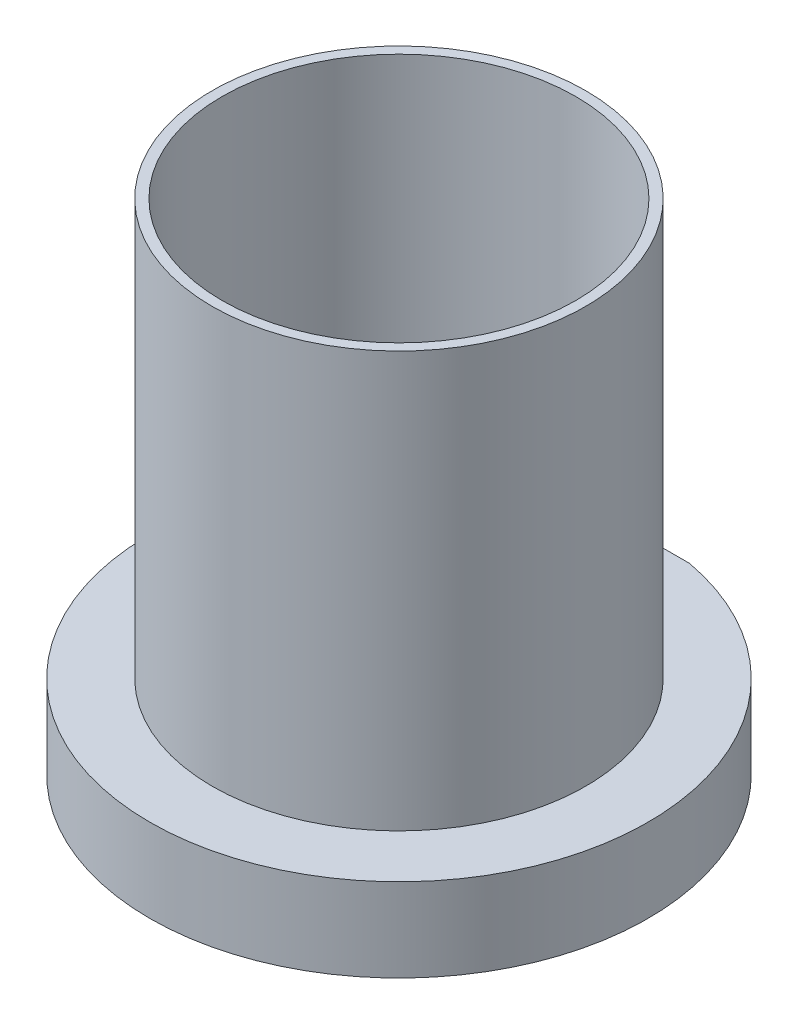
ISO-10303-21;
HEADER;
FILE_DESCRIPTION(('STEP AP214'),'2;1');
FILE_NAME('part.step','',(''),(''),'','','');
FILE_SCHEMA(('AUTOMOTIVE_DESIGN { 1 0 10303 214 1 1 1 1 }'));
ENDSEC;
DATA;
#1=APPLICATION_CONTEXT('core data for automotive mechanical design processes');
#2=APPLICATION_PROTOCOL_DEFINITION('international standard','automotive_design',2000,#1);
#3=PRODUCT_CONTEXT('',#1,'mechanical');
#4=PRODUCT('Part','Part','',(#3));
#5=PRODUCT_RELATED_PRODUCT_CATEGORY('part','',(#4));
#6=PRODUCT_DEFINITION_FORMATION('','',#4);
#7=PRODUCT_DEFINITION_CONTEXT('part definition',#1,'design');
#8=PRODUCT_DEFINITION('design','',#6,#7);
#9=PRODUCT_DEFINITION_SHAPE('','',#8);
#10=(LENGTH_UNIT() NAMED_UNIT(*) SI_UNIT(.MILLI.,.METRE.));
#11=(NAMED_UNIT(*) PLANE_ANGLE_UNIT() SI_UNIT($,.RADIAN.));
#12=(NAMED_UNIT(*) SI_UNIT($,.STERADIAN.) SOLID_ANGLE_UNIT());
#13=UNCERTAINTY_MEASURE_WITH_UNIT(LENGTH_MEASURE(1.E-05),#10,'distance_accuracy_value','');
#14=(GEOMETRIC_REPRESENTATION_CONTEXT(3) GLOBAL_UNCERTAINTY_ASSIGNED_CONTEXT((#13)) GLOBAL_UNIT_ASSIGNED_CONTEXT((#10,
#11,#12)) REPRESENTATION_CONTEXT('',''));
#15=CARTESIAN_POINT('',(0.,0.,0.));
#16=DIRECTION('',(0.,0.,1.));
#17=DIRECTION('',(1.,0.,0.));
#18=AXIS2_PLACEMENT_3D('',#15,#16,#17);
#19=CARTESIAN_POINT('',(0.,1.0033,0.));
#20=DIRECTION('',(0.,1.,0.));
#21=DIRECTION('',(0.,0.,1.));
#22=AXIS2_PLACEMENT_3D('',#19,#20,#21);
#23=PLANE('',#22);
#24=CARTESIAN_POINT('',(0.,1.0033,0.));
#25=DIRECTION('',(0.,-1.,0.));
#26=DIRECTION('',(0.,0.,-1.));
#27=AXIS2_PLACEMENT_3D('',#24,#25,#26);
#28=CIRCLE('',#27,4.4958);
#29=CARTESIAN_POINT('',(0.,1.0033,-4.4958));
#30=VERTEX_POINT('',#29);
#31=EDGE_CURVE('E20',#30,#30,#28,.F.);
#32=ORIENTED_EDGE('',*,*,#31,.F.);
#33=EDGE_LOOP('',(#32));
#34=FACE_BOUND('',#33,.T.);
#35=DIRECTION('',(1.,0.,0.));
#36=VECTOR('',#35,1.);
#37=CARTESIAN_POINT('',(1.143,1.0033,-5.89308787014298));
#38=LINE('',#37,#36);
#39=CARTESIAN_POINT('',(1.09742731639668,1.0033,-5.89308787014298));
#40=VERTEX_POINT('',#39);
#41=CARTESIAN_POINT('',(-1.09742731639669,1.0033,-5.89308787014298));
#42=VERTEX_POINT('',#41);
#43=EDGE_CURVE('E44',#40,#42,#38,.F.);
#44=ORIENTED_EDGE('',*,*,#43,.T.);
#45=CARTESIAN_POINT('',(0.,1.0033,0.));
#46=DIRECTION('',(0.,-1.,0.));
#47=DIRECTION('',(0.,0.,-1.));
#48=AXIS2_PLACEMENT_3D('',#45,#46,#47);
#49=CIRCLE('',#48,5.9944);
#50=EDGE_CURVE('E47',#40,#42,#49,.T.);
#51=ORIENTED_EDGE('',*,*,#50,.F.);
#52=EDGE_LOOP('',(#44,#51));
#53=FACE_BOUND('',#52,.T.);
#54=ADVANCED_FACE('F17',(#34,#53),#23,.T.);
#55=CARTESIAN_POINT('',(0.,11.00328,0.));
#56=DIRECTION('',(0.,-1.,0.));
#57=DIRECTION('',(0.,0.,-1.));
#58=AXIS2_PLACEMENT_3D('',#55,#56,#57);
#59=CYLINDRICAL_SURFACE('',#58,4.4958);
#60=ORIENTED_EDGE('',*,*,#31,.T.);
#61=EDGE_LOOP('',(#60));
#62=FACE_BOUND('',#61,.T.);
#63=CARTESIAN_POINT('',(0.,11.00328,0.));
#64=DIRECTION('',(0.,-1.,0.));
#65=DIRECTION('',(0.,0.,-1.));
#66=AXIS2_PLACEMENT_3D('',#63,#64,#65);
#67=CIRCLE('',#66,4.4958);
#68=CARTESIAN_POINT('',(0.,11.00328,-4.4958));
#69=VERTEX_POINT('',#68);
#70=EDGE_CURVE('E56',#69,#69,#67,.F.);
#71=ORIENTED_EDGE('',*,*,#70,.F.);
#72=EDGE_LOOP('',(#71));
#73=FACE_BOUND('',#72,.T.);
#74=ADVANCED_FACE('F70',(#62,#73),#59,.T.);
#75=CARTESIAN_POINT('',(1.143,11.00328,-5.89308787014298));
#76=DIRECTION('',(0.,0.,1.));
#77=DIRECTION('',(1.,0.,0.));
#78=AXIS2_PLACEMENT_3D('',#75,#76,#77);
#79=PLANE('',#78);
#80=DIRECTION('',(0.,-1.,0.));
#81=VECTOR('',#80,1.);
#82=CARTESIAN_POINT('',(1.09742731639668,1.0033,-5.89308787014298));
#83=LINE('',#82,#81);
#84=CARTESIAN_POINT('',(1.09742731639668,-1.0033,-5.89308787014298));
#85=VERTEX_POINT('',#84);
#86=EDGE_CURVE('E49',#85,#40,#83,.F.);
#87=ORIENTED_EDGE('',*,*,#86,.F.);
#88=DIRECTION('',(1.,0.,0.));
#89=VECTOR('',#88,1.);
#90=CARTESIAN_POINT('',(0.,-1.0033,-5.89308787014298));
#91=LINE('',#90,#89);
#92=CARTESIAN_POINT('',(-1.09742731639669,-1.0033,-5.89308787014298));
#93=VERTEX_POINT('',#92);
#94=EDGE_CURVE('E54',#85,#93,#91,.F.);
#95=ORIENTED_EDGE('',*,*,#94,.T.);
#96=DIRECTION('',(0.,-1.,0.));
#97=VECTOR('',#96,1.);
#98=CARTESIAN_POINT('',(-1.09742731639669,1.0033,-5.89308787014298));
#99=LINE('',#98,#97);
#100=EDGE_CURVE('E35',#42,#93,#99,.T.);
#101=ORIENTED_EDGE('',*,*,#100,.F.);
#102=ORIENTED_EDGE('',*,*,#43,.F.);
#103=EDGE_LOOP('',(#87,#95,#101,#102));
#104=FACE_BOUND('',#103,.T.);
#105=ADVANCED_FACE('F53',(#104),#79,.F.);
#106=CARTESIAN_POINT('',(0.,1.0033,0.));
#107=DIRECTION('',(0.,-1.,0.));
#108=DIRECTION('',(0.,0.,-1.));
#109=AXIS2_PLACEMENT_3D('',#106,#107,#108);
#110=CYLINDRICAL_SURFACE('',#109,5.9944);
#111=CARTESIAN_POINT('',(0.,-1.0033,0.));
#112=DIRECTION('',(0.,-1.,0.));
#113=DIRECTION('',(0.,0.,-1.));
#114=AXIS2_PLACEMENT_3D('',#111,#112,#113);
#115=CIRCLE('',#114,5.9944);
#116=EDGE_CURVE('E62',#93,#85,#115,.F.);
#117=ORIENTED_EDGE('',*,*,#116,.T.);
#118=ORIENTED_EDGE('',*,*,#86,.T.);
#119=ORIENTED_EDGE('',*,*,#50,.T.);
#120=ORIENTED_EDGE('',*,*,#100,.T.);
#121=EDGE_LOOP('',(#117,#118,#119,#120));
#122=FACE_BOUND('',#121,.T.);
#123=ADVANCED_FACE('F48',(#122),#110,.T.);
#124=CARTESIAN_POINT('',(0.,11.00328,0.));
#125=DIRECTION('',(0.,1.,0.));
#126=DIRECTION('',(0.,0.,1.));
#127=AXIS2_PLACEMENT_3D('',#124,#125,#126);
#128=PLANE('',#127);
#129=ORIENTED_EDGE('',*,*,#70,.T.);
#130=EDGE_LOOP('',(#129));
#131=FACE_BOUND('',#130,.T.);
#132=CARTESIAN_POINT('',(0.,11.00328,0.));
#133=DIRECTION('',(0.,1.,0.));
#134=DIRECTION('',(0.,0.,1.));
#135=AXIS2_PLACEMENT_3D('',#132,#133,#134);
#136=CIRCLE('',#135,4.2545);
#137=CARTESIAN_POINT('',(0.,11.00328,4.2545));
#138=VERTEX_POINT('',#137);
#139=EDGE_CURVE('E26',#138,#138,#136,.F.);
#140=ORIENTED_EDGE('',*,*,#139,.T.);
#141=EDGE_LOOP('',(#140));
#142=FACE_BOUND('',#141,.T.);
#143=ADVANCED_FACE('F67',(#131,#142),#128,.T.);
#144=CARTESIAN_POINT('',(0.,-1.0033,0.));
#145=DIRECTION('',(0.,1.,0.));
#146=DIRECTION('',(0.,0.,1.));
#147=AXIS2_PLACEMENT_3D('',#144,#145,#146);
#148=PLANE('',#147);
#149=ORIENTED_EDGE('',*,*,#94,.F.);
#150=ORIENTED_EDGE('',*,*,#116,.F.);
#151=EDGE_LOOP('',(#149,#150));
#152=FACE_BOUND('',#151,.T.);
#153=CARTESIAN_POINT('',(0.,-1.0033,0.));
#154=DIRECTION('',(0.,1.,0.));
#155=DIRECTION('',(0.,0.,1.));
#156=AXIS2_PLACEMENT_3D('',#153,#154,#155);
#157=CIRCLE('',#156,4.2545);
#158=CARTESIAN_POINT('',(0.,-1.0033,4.2545));
#159=VERTEX_POINT('',#158);
#160=EDGE_CURVE('E11',#159,#159,#157,.T.);
#161=ORIENTED_EDGE('',*,*,#160,.T.);
#162=EDGE_LOOP('',(#161));
#163=FACE_BOUND('',#162,.T.);
#164=ADVANCED_FACE('F83',(#152,#163),#148,.F.);
#165=CARTESIAN_POINT('',(0.,-1.0033,0.));
#166=DIRECTION('',(0.,1.,0.));
#167=DIRECTION('',(0.,0.,1.));
#168=AXIS2_PLACEMENT_3D('',#165,#166,#167);
#169=CYLINDRICAL_SURFACE('',#168,4.2545);
#170=ORIENTED_EDGE('',*,*,#139,.F.);
#171=EDGE_LOOP('',(#170));
#172=FACE_BOUND('',#171,.T.);
#173=ORIENTED_EDGE('',*,*,#160,.F.);
#174=EDGE_LOOP('',(#173));
#175=FACE_BOUND('',#174,.T.);
#176=ADVANCED_FACE('F81',(#172,#175),#169,.F.);
#177=CLOSED_SHELL('',(#54,#74,#105,#123,#143,#164,#176));
#178=MANIFOLD_SOLID_BREP('B1',#177);
#179=ADVANCED_BREP_SHAPE_REPRESENTATION('',(#18,#178),#14);
#180=SHAPE_DEFINITION_REPRESENTATION(#9,#179);
ENDSEC;
END-ISO-10303-21;
